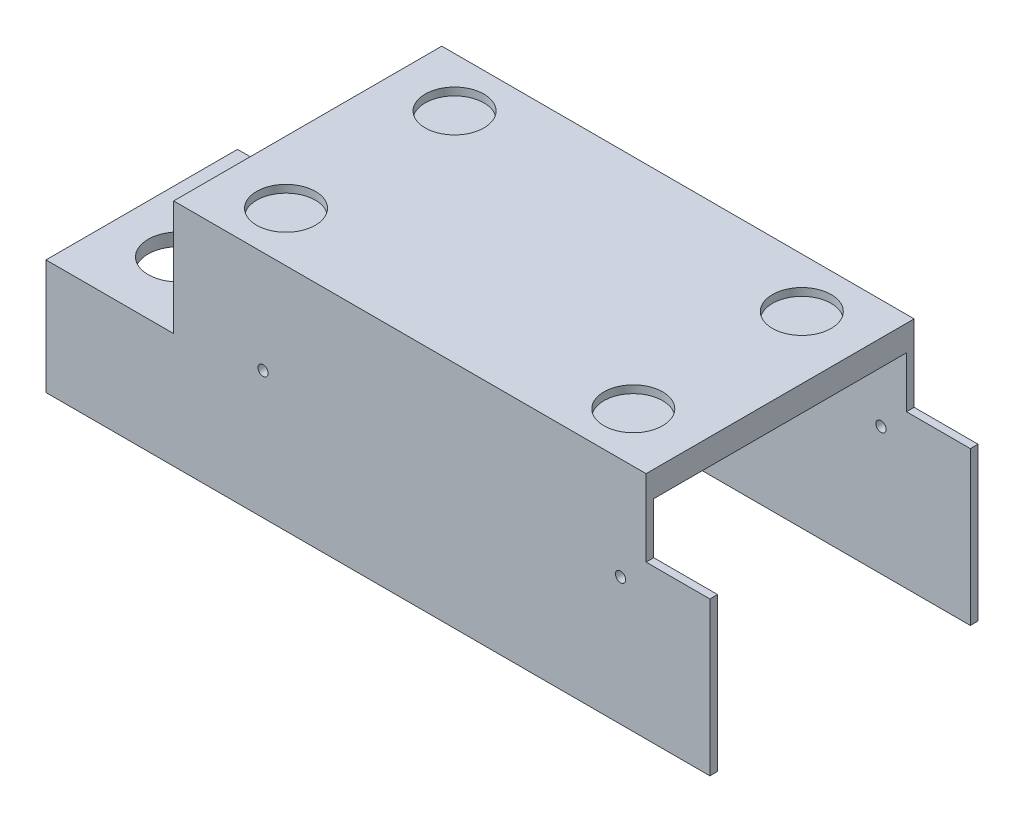
ISO-10303-21;
HEADER;
FILE_DESCRIPTION(('STEP AP214'),'2;1');
FILE_NAME('part.step','',(''),(''),'','','');
FILE_SCHEMA(('AUTOMOTIVE_DESIGN { 1 0 10303 214 1 1 1 1 }'));
ENDSEC;
DATA;
#1=APPLICATION_CONTEXT('core data for automotive mechanical design processes');
#2=APPLICATION_PROTOCOL_DEFINITION('international standard','automotive_design',2000,#1);
#3=PRODUCT_CONTEXT('',#1,'mechanical');
#4=PRODUCT('Part','Part','',(#3));
#5=PRODUCT_RELATED_PRODUCT_CATEGORY('part','',(#4));
#6=PRODUCT_DEFINITION_FORMATION('','',#4);
#7=PRODUCT_DEFINITION_CONTEXT('part definition',#1,'design');
#8=PRODUCT_DEFINITION('design','',#6,#7);
#9=PRODUCT_DEFINITION_SHAPE('','',#8);
#10=(LENGTH_UNIT() NAMED_UNIT(*) SI_UNIT(.MILLI.,.METRE.));
#11=(NAMED_UNIT(*) PLANE_ANGLE_UNIT() SI_UNIT($,.RADIAN.));
#12=(NAMED_UNIT(*) SI_UNIT($,.STERADIAN.) SOLID_ANGLE_UNIT());
#13=UNCERTAINTY_MEASURE_WITH_UNIT(LENGTH_MEASURE(1.E-05),#10,'distance_accuracy_value','');
#14=(GEOMETRIC_REPRESENTATION_CONTEXT(3) GLOBAL_UNCERTAINTY_ASSIGNED_CONTEXT((#13)) GLOBAL_UNIT_ASSIGNED_CONTEXT((#10,
#11,#12)) REPRESENTATION_CONTEXT('',''));
#15=CARTESIAN_POINT('',(0.,0.,0.));
#16=DIRECTION('',(0.,0.,1.));
#17=DIRECTION('',(1.,0.,0.));
#18=AXIS2_PLACEMENT_3D('',#15,#16,#17);
#19=CARTESIAN_POINT('',(105.,90.,-52.5));
#20=DIRECTION('',(-1.,0.,0.));
#21=DIRECTION('',(0.,0.,1.));
#22=AXIS2_PLACEMENT_3D('',#19,#20,#21);
#23=PLANE('',#22);
#24=DIRECTION('',(0.,-1.,0.));
#25=VECTOR('',#24,1.);
#26=CARTESIAN_POINT('',(105.,90.,-52.5));
#27=LINE('',#26,#25);
#28=CARTESIAN_POINT('',(105.,60.,-52.5));
#29=VERTEX_POINT('',#28);
#30=CARTESIAN_POINT('',(105.,0.,-52.5));
#31=VERTEX_POINT('',#30);
#32=EDGE_CURVE('E184',#29,#31,#27,.T.);
#33=ORIENTED_EDGE('',*,*,#32,.F.);
#34=DIRECTION('',(0.,0.,-1.));
#35=VECTOR('',#34,1.);
#36=CARTESIAN_POINT('',(105.,60.,-52.5));
#37=LINE('',#36,#35);
#38=CARTESIAN_POINT('',(105.,60.,-49.5));
#39=VERTEX_POINT('',#38);
#40=EDGE_CURVE('E167',#39,#29,#37,.T.);
#41=ORIENTED_EDGE('',*,*,#40,.F.);
#42=DIRECTION('',(0.,1.,0.));
#43=VECTOR('',#42,1.);
#44=CARTESIAN_POINT('',(105.,0.,-49.5));
#45=LINE('',#44,#43);
#46=CARTESIAN_POINT('',(105.,0.,-49.5));
#47=VERTEX_POINT('',#46);
#48=EDGE_CURVE('E307',#47,#39,#45,.T.);
#49=ORIENTED_EDGE('',*,*,#48,.F.);
#50=DIRECTION('',(0.,0.,-1.));
#51=VECTOR('',#50,1.);
#52=CARTESIAN_POINT('',(105.,0.,-52.5));
#53=LINE('',#52,#51);
#54=EDGE_CURVE('E191',#47,#31,#53,.T.);
#55=ORIENTED_EDGE('',*,*,#54,.T.);
#56=EDGE_LOOP('',(#33,#41,#49,#55));
#57=FACE_BOUND('',#56,.T.);
#58=ADVANCED_FACE('F42',(#57),#23,.F.);
#59=CARTESIAN_POINT('',(0.,0.,0.));
#60=DIRECTION('',(0.,1.,0.));
#61=DIRECTION('',(0.,0.,1.));
#62=AXIS2_PLACEMENT_3D('',#59,#60,#61);
#63=PLANE('',#62);
#64=DIRECTION('',(0.,0.,-1.));
#65=VECTOR('',#64,1.);
#66=CARTESIAN_POINT('',(-95.,0.,49.5));
#67=LINE('',#66,#65);
#68=CARTESIAN_POINT('',(-95.,0.,-19.5));
#69=VERTEX_POINT('',#68);
#70=CARTESIAN_POINT('',(-95.,0.,-49.5));
#71=VERTEX_POINT('',#70);
#72=EDGE_CURVE('E306',#69,#71,#67,.T.);
#73=ORIENTED_EDGE('',*,*,#72,.F.);
#74=DIRECTION('',(-1.,0.,0.));
#75=VECTOR('',#74,1.);
#76=CARTESIAN_POINT('',(105.,0.,-19.5));
#77=LINE('',#76,#75);
#78=CARTESIAN_POINT('',(-155.,0.,-19.5));
#79=VERTEX_POINT('',#78);
#80=EDGE_CURVE('E248',#69,#79,#77,.T.);
#81=ORIENTED_EDGE('',*,*,#80,.T.);
#82=DIRECTION('',(0.,0.,1.));
#83=VECTOR('',#82,1.);
#84=CARTESIAN_POINT('',(-155.,0.,52.5));
#85=LINE('',#84,#83);
#86=CARTESIAN_POINT('',(-155.,0.,-22.5));
#87=VERTEX_POINT('',#86);
#88=EDGE_CURVE('E279',#87,#79,#85,.T.);
#89=ORIENTED_EDGE('',*,*,#88,.F.);
#90=DIRECTION('',(1.,0.,0.));
#91=VECTOR('',#90,1.);
#92=CARTESIAN_POINT('',(-155.,0.,-22.5));
#93=LINE('',#92,#91);
#94=CARTESIAN_POINT('',(-105.,0.,-22.5));
#95=VERTEX_POINT('',#94);
#96=EDGE_CURVE('E283',#87,#95,#93,.T.);
#97=ORIENTED_EDGE('',*,*,#96,.T.);
#98=DIRECTION('',(0.,0.,1.));
#99=VECTOR('',#98,1.);
#100=CARTESIAN_POINT('',(-105.,0.,-52.5));
#101=LINE('',#100,#99);
#102=CARTESIAN_POINT('',(-105.,0.,-52.5));
#103=VERTEX_POINT('',#102);
#104=EDGE_CURVE('E354',#103,#95,#101,.T.);
#105=ORIENTED_EDGE('',*,*,#104,.F.);
#106=DIRECTION('',(-1.,0.,0.));
#107=VECTOR('',#106,1.);
#108=CARTESIAN_POINT('',(-105.,0.,-52.5));
#109=LINE('',#108,#107);
#110=EDGE_CURVE('E351',#31,#103,#109,.T.);
#111=ORIENTED_EDGE('',*,*,#110,.F.);
#112=ORIENTED_EDGE('',*,*,#54,.F.);
#113=DIRECTION('',(1.,0.,0.));
#114=VECTOR('',#113,1.);
#115=CARTESIAN_POINT('',(-95.,0.,-49.5));
#116=LINE('',#115,#114);
#117=EDGE_CURVE('E330',#71,#47,#116,.T.);
#118=ORIENTED_EDGE('',*,*,#117,.F.);
#119=EDGE_LOOP('',(#73,#81,#89,#97,#105,#111,#112,#118));
#120=FACE_BOUND('',#119,.T.);
#121=ADVANCED_FACE('F457',(#120),#63,.F.);
#122=CARTESIAN_POINT('',(-105.,90.,-52.5));
#123=DIRECTION('',(1.,0.,0.));
#124=DIRECTION('',(0.,0.,-1.));
#125=AXIS2_PLACEMENT_3D('',#122,#123,#124);
#126=PLANE('',#125);
#127=DIRECTION('',(0.,-1.,0.));
#128=VECTOR('',#127,1.);
#129=CARTESIAN_POINT('',(-105.,0.,-22.5));
#130=LINE('',#129,#128);
#131=CARTESIAN_POINT('',(-105.,45.,-22.5));
#132=VERTEX_POINT('',#131);
#133=EDGE_CURVE('E272',#132,#95,#130,.T.);
#134=ORIENTED_EDGE('',*,*,#133,.F.);
#135=DIRECTION('',(0.,0.,-1.));
#136=VECTOR('',#135,1.);
#137=CARTESIAN_POINT('',(-105.,45.,52.5));
#138=LINE('',#137,#136);
#139=CARTESIAN_POINT('',(-105.,45.,52.5));
#140=VERTEX_POINT('',#139);
#141=EDGE_CURVE('E266',#140,#132,#138,.T.);
#142=ORIENTED_EDGE('',*,*,#141,.F.);
#143=DIRECTION('',(0.,-1.,0.));
#144=VECTOR('',#143,1.);
#145=CARTESIAN_POINT('',(-105.,90.,52.5));
#146=LINE('',#145,#144);
#147=CARTESIAN_POINT('',(-105.,90.,52.5));
#148=VERTEX_POINT('',#147);
#149=EDGE_CURVE('E200',#148,#140,#146,.T.);
#150=ORIENTED_EDGE('',*,*,#149,.F.);
#151=DIRECTION('',(0.,0.,1.));
#152=VECTOR('',#151,1.);
#153=CARTESIAN_POINT('',(-105.,90.,-52.5));
#154=LINE('',#153,#152);
#155=CARTESIAN_POINT('',(-105.,90.,-52.5));
#156=VERTEX_POINT('',#155);
#157=EDGE_CURVE('E338',#156,#148,#154,.T.);
#158=ORIENTED_EDGE('',*,*,#157,.F.);
#159=DIRECTION('',(0.,-1.,0.));
#160=VECTOR('',#159,1.);
#161=CARTESIAN_POINT('',(-105.,90.,-52.5));
#162=LINE('',#161,#160);
#163=EDGE_CURVE('E194',#156,#103,#162,.T.);
#164=ORIENTED_EDGE('',*,*,#163,.T.);
#165=ORIENTED_EDGE('',*,*,#104,.T.);
#166=EDGE_LOOP('',(#134,#142,#150,#158,#164,#165));
#167=FACE_BOUND('',#166,.T.);
#168=ADVANCED_FACE('F461',(#167),#126,.F.);
#169=DIRECTION('',(0.,-1.,0.));
#170=VECTOR('',#169,1.);
#171=CARTESIAN_POINT('',(105.,0.,49.5));
#172=LINE('',#171,#170);
#173=CARTESIAN_POINT('',(105.,60.,49.5));
#174=VERTEX_POINT('',#173);
#175=CARTESIAN_POINT('',(105.,0.,49.5));
#176=VERTEX_POINT('',#175);
#177=EDGE_CURVE('E301',#174,#176,#172,.T.);
#178=ORIENTED_EDGE('',*,*,#177,.F.);
#179=CARTESIAN_POINT('',(105.,60.,52.5));
#180=VERTEX_POINT('',#179);
#181=EDGE_CURVE('E178',#180,#174,#37,.T.);
#182=ORIENTED_EDGE('',*,*,#181,.F.);
#183=DIRECTION('',(0.,-1.,0.));
#184=VECTOR('',#183,1.);
#185=CARTESIAN_POINT('',(105.,90.,52.5));
#186=LINE('',#185,#184);
#187=CARTESIAN_POINT('',(105.,0.,52.5));
#188=VERTEX_POINT('',#187);
#189=EDGE_CURVE('E346',#180,#188,#186,.T.);
#190=ORIENTED_EDGE('',*,*,#189,.T.);
#191=EDGE_CURVE('E347',#188,#176,#53,.T.);
#192=ORIENTED_EDGE('',*,*,#191,.T.);
#193=EDGE_LOOP('',(#178,#182,#190,#192));
#194=FACE_BOUND('',#193,.T.);
#195=ADVANCED_FACE('F44',(#194),#23,.F.);
#196=CARTESIAN_POINT('',(-105.,90.,-52.5));
#197=DIRECTION('',(0.,0.,1.));
#198=DIRECTION('',(1.,0.,0.));
#199=AXIS2_PLACEMENT_3D('',#196,#197,#198);
#200=PLANE('',#199);
#201=CARTESIAN_POINT('',(-70.,50.,-52.5));
#202=DIRECTION('',(0.,0.,1.));
#203=DIRECTION('',(1.,0.,0.));
#204=AXIS2_PLACEMENT_3D('',#201,#202,#203);
#205=CIRCLE('',#204,2.);
#206=CARTESIAN_POINT('',(-68.,50.,-52.5));
#207=VERTEX_POINT('',#206);
#208=EDGE_CURVE('E215',#207,#207,#205,.T.);
#209=ORIENTED_EDGE('',*,*,#208,.T.);
#210=EDGE_LOOP('',(#209));
#211=FACE_BOUND('',#210,.T.);
#212=CARTESIAN_POINT('',(70.,50.,-52.5));
#213=DIRECTION('',(0.,0.,1.));
#214=DIRECTION('',(1.,0.,0.));
#215=AXIS2_PLACEMENT_3D('',#212,#213,#214);
#216=CIRCLE('',#215,2.);
#217=CARTESIAN_POINT('',(72.,50.,-52.5));
#218=VERTEX_POINT('',#217);
#219=EDGE_CURVE('E428',#218,#218,#216,.T.);
#220=ORIENTED_EDGE('',*,*,#219,.T.);
#221=EDGE_LOOP('',(#220));
#222=FACE_BOUND('',#221,.T.);
#223=DIRECTION('',(-1.,0.,0.));
#224=VECTOR('',#223,1.);
#225=CARTESIAN_POINT('',(-105.,90.,-52.5));
#226=LINE('',#225,#224);
#227=CARTESIAN_POINT('',(80.,90.,-52.5));
#228=VERTEX_POINT('',#227);
#229=EDGE_CURVE('E335',#228,#156,#226,.T.);
#230=ORIENTED_EDGE('',*,*,#229,.F.);
#231=DIRECTION('',(0.,1.,0.));
#232=VECTOR('',#231,1.);
#233=CARTESIAN_POINT('',(80.,60.,-52.5));
#234=LINE('',#233,#232);
#235=CARTESIAN_POINT('',(80.,60.,-52.5));
#236=VERTEX_POINT('',#235);
#237=EDGE_CURVE('E186',#236,#228,#234,.T.);
#238=ORIENTED_EDGE('',*,*,#237,.F.);
#239=DIRECTION('',(-1.,0.,0.));
#240=VECTOR('',#239,1.);
#241=CARTESIAN_POINT('',(105.,60.,-52.5));
#242=LINE('',#241,#240);
#243=EDGE_CURVE('E170',#29,#236,#242,.T.);
#244=ORIENTED_EDGE('',*,*,#243,.F.);
#245=ORIENTED_EDGE('',*,*,#32,.T.);
#246=ORIENTED_EDGE('',*,*,#110,.T.);
#247=ORIENTED_EDGE('',*,*,#163,.F.);
#248=EDGE_LOOP('',(#230,#238,#244,#245,#246,#247));
#249=FACE_BOUND('',#248,.T.);
#250=ADVANCED_FACE('F183',(#211,#222,#249),#200,.F.);
#251=CARTESIAN_POINT('',(-105.,90.,52.5));
#252=DIRECTION('',(0.,0.,-1.));
#253=DIRECTION('',(-1.,0.,0.));
#254=AXIS2_PLACEMENT_3D('',#251,#252,#253);
#255=PLANE('',#254);
#256=CARTESIAN_POINT('',(-70.,50.,52.5));
#257=DIRECTION('',(0.,0.,1.));
#258=DIRECTION('',(1.,0.,0.));
#259=AXIS2_PLACEMENT_3D('',#256,#257,#258);
#260=CIRCLE('',#259,2.);
#261=CARTESIAN_POINT('',(-68.,50.,52.5));
#262=VERTEX_POINT('',#261);
#263=EDGE_CURVE('E425',#262,#262,#260,.T.);
#264=ORIENTED_EDGE('',*,*,#263,.F.);
#265=EDGE_LOOP('',(#264));
#266=FACE_BOUND('',#265,.T.);
#267=CARTESIAN_POINT('',(70.,50.,52.5));
#268=DIRECTION('',(0.,0.,1.));
#269=DIRECTION('',(1.,0.,0.));
#270=AXIS2_PLACEMENT_3D('',#267,#268,#269);
#271=CIRCLE('',#270,2.);
#272=CARTESIAN_POINT('',(72.,50.,52.5));
#273=VERTEX_POINT('',#272);
#274=EDGE_CURVE('E233',#273,#273,#271,.T.);
#275=ORIENTED_EDGE('',*,*,#274,.F.);
#276=EDGE_LOOP('',(#275));
#277=FACE_BOUND('',#276,.T.);
#278=DIRECTION('',(1.,0.,0.));
#279=VECTOR('',#278,1.);
#280=CARTESIAN_POINT('',(105.,60.,52.5));
#281=LINE('',#280,#279);
#282=CARTESIAN_POINT('',(80.,60.,52.5));
#283=VERTEX_POINT('',#282);
#284=EDGE_CURVE('E400',#283,#180,#281,.T.);
#285=ORIENTED_EDGE('',*,*,#284,.F.);
#286=DIRECTION('',(0.,1.,0.));
#287=VECTOR('',#286,1.);
#288=CARTESIAN_POINT('',(80.,60.,52.5));
#289=LINE('',#288,#287);
#290=CARTESIAN_POINT('',(80.,90.,52.5));
#291=VERTEX_POINT('',#290);
#292=EDGE_CURVE('E406',#283,#291,#289,.T.);
#293=ORIENTED_EDGE('',*,*,#292,.T.);
#294=DIRECTION('',(1.,0.,0.));
#295=VECTOR('',#294,1.);
#296=CARTESIAN_POINT('',(-105.,90.,52.5));
#297=LINE('',#296,#295);
#298=EDGE_CURVE('E342',#148,#291,#297,.T.);
#299=ORIENTED_EDGE('',*,*,#298,.F.);
#300=ORIENTED_EDGE('',*,*,#149,.T.);
#301=DIRECTION('',(1.,0.,0.));
#302=VECTOR('',#301,1.);
#303=CARTESIAN_POINT('',(-155.,45.,52.5));
#304=LINE('',#303,#302);
#305=CARTESIAN_POINT('',(-155.,45.,52.5));
#306=VERTEX_POINT('',#305);
#307=EDGE_CURVE('E297',#306,#140,#304,.T.);
#308=ORIENTED_EDGE('',*,*,#307,.F.);
#309=DIRECTION('',(0.,1.,0.));
#310=VECTOR('',#309,1.);
#311=CARTESIAN_POINT('',(-155.,0.,52.5));
#312=LINE('',#311,#310);
#313=CARTESIAN_POINT('',(-155.,0.,52.5));
#314=VERTEX_POINT('',#313);
#315=EDGE_CURVE('E267',#314,#306,#312,.T.);
#316=ORIENTED_EDGE('',*,*,#315,.F.);
#317=DIRECTION('',(1.,0.,0.));
#318=VECTOR('',#317,1.);
#319=CARTESIAN_POINT('',(-105.,0.,52.5));
#320=LINE('',#319,#318);
#321=EDGE_CURVE('E339',#314,#188,#320,.T.);
#322=ORIENTED_EDGE('',*,*,#321,.T.);
#323=ORIENTED_EDGE('',*,*,#189,.F.);
#324=EDGE_LOOP('',(#285,#293,#299,#300,#308,#316,#322,#323));
#325=FACE_BOUND('',#324,.T.);
#326=ADVANCED_FACE('F369',(#266,#277,#325),#255,.F.);
#327=CARTESIAN_POINT('',(0.,90.,0.));
#328=DIRECTION('',(0.,1.,0.));
#329=DIRECTION('',(0.,0.,1.));
#330=AXIS2_PLACEMENT_3D('',#327,#328,#329);
#331=PLANE('',#330);
#332=CARTESIAN_POINT('',(55.5,90.,-33.));
#333=DIRECTION('',(0.,1.,0.));
#334=DIRECTION('',(0.,0.,1.));
#335=AXIS2_PLACEMENT_3D('',#332,#333,#334);
#336=CIRCLE('',#335,11.5);
#337=CARTESIAN_POINT('',(55.5,90.,-21.5));
#338=VERTEX_POINT('',#337);
#339=EDGE_CURVE('E628',#338,#338,#336,.T.);
#340=ORIENTED_EDGE('',*,*,#339,.F.);
#341=EDGE_LOOP('',(#340));
#342=FACE_BOUND('',#341,.T.);
#343=CARTESIAN_POINT('',(-80.5,90.,33.));
#344=DIRECTION('',(0.,1.,0.));
#345=DIRECTION('',(0.,0.,1.));
#346=AXIS2_PLACEMENT_3D('',#343,#344,#345);
#347=CIRCLE('',#346,11.5);
#348=CARTESIAN_POINT('',(-80.5,90.,44.5));
#349=VERTEX_POINT('',#348);
#350=EDGE_CURVE('E612',#349,#349,#347,.T.);
#351=ORIENTED_EDGE('',*,*,#350,.F.);
#352=EDGE_LOOP('',(#351));
#353=FACE_BOUND('',#352,.T.);
#354=CARTESIAN_POINT('',(55.5,90.,33.));
#355=DIRECTION('',(0.,1.,0.));
#356=DIRECTION('',(0.,0.,1.));
#357=AXIS2_PLACEMENT_3D('',#354,#355,#356);
#358=CIRCLE('',#357,11.5);
#359=CARTESIAN_POINT('',(55.5,90.,44.5));
#360=VERTEX_POINT('',#359);
#361=EDGE_CURVE('E613',#360,#360,#358,.T.);
#362=ORIENTED_EDGE('',*,*,#361,.F.);
#363=EDGE_LOOP('',(#362));
#364=FACE_BOUND('',#363,.T.);
#365=CARTESIAN_POINT('',(-80.5,90.,-33.));
#366=DIRECTION('',(0.,1.,0.));
#367=DIRECTION('',(0.,0.,1.));
#368=AXIS2_PLACEMENT_3D('',#365,#366,#367);
#369=CIRCLE('',#368,11.5);
#370=CARTESIAN_POINT('',(-80.5,90.,-21.5));
#371=VERTEX_POINT('',#370);
#372=EDGE_CURVE('E395',#371,#371,#369,.T.);
#373=ORIENTED_EDGE('',*,*,#372,.F.);
#374=EDGE_LOOP('',(#373));
#375=FACE_BOUND('',#374,.T.);
#376=DIRECTION('',(0.,0.,1.));
#377=VECTOR('',#376,1.);
#378=CARTESIAN_POINT('',(80.,90.,-52.5));
#379=LINE('',#378,#377);
#380=EDGE_CURVE('E179',#228,#291,#379,.T.);
#381=ORIENTED_EDGE('',*,*,#380,.F.);
#382=ORIENTED_EDGE('',*,*,#229,.T.);
#383=ORIENTED_EDGE('',*,*,#157,.T.);
#384=ORIENTED_EDGE('',*,*,#298,.T.);
#385=EDGE_LOOP('',(#381,#382,#383,#384));
#386=FACE_BOUND('',#385,.T.);
#387=ADVANCED_FACE('F443',(#342,#353,#364,#375,#386),#331,.T.);
#388=CARTESIAN_POINT('',(-155.,0.,49.5));
#389=VERTEX_POINT('',#388);
#390=EDGE_CURVE('E278',#389,#314,#85,.T.);
#391=ORIENTED_EDGE('',*,*,#390,.F.);
#392=DIRECTION('',(1.,0.,0.));
#393=VECTOR('',#392,1.);
#394=CARTESIAN_POINT('',(-95.,0.,49.5));
#395=LINE('',#394,#393);
#396=EDGE_CURVE('E66',#389,#176,#395,.T.);
#397=ORIENTED_EDGE('',*,*,#396,.T.);
#398=ORIENTED_EDGE('',*,*,#191,.F.);
#399=ORIENTED_EDGE('',*,*,#321,.F.);
#400=EDGE_LOOP('',(#391,#397,#398,#399));
#401=FACE_BOUND('',#400,.T.);
#402=ADVANCED_FACE('F386',(#401),#63,.F.);
#403=CARTESIAN_POINT('',(-95.,0.,49.5));
#404=DIRECTION('',(0.,0.,1.));
#405=DIRECTION('',(1.,0.,0.));
#406=AXIS2_PLACEMENT_3D('',#403,#404,#405);
#407=PLANE('',#406);
#408=CARTESIAN_POINT('',(-70.,50.,49.5));
#409=DIRECTION('',(0.,0.,1.));
#410=DIRECTION('',(1.,0.,0.));
#411=AXIS2_PLACEMENT_3D('',#408,#409,#410);
#412=CIRCLE('',#411,2.);
#413=CARTESIAN_POINT('',(-68.,50.,49.5));
#414=VERTEX_POINT('',#413);
#415=EDGE_CURVE('E219',#414,#414,#412,.T.);
#416=ORIENTED_EDGE('',*,*,#415,.T.);
#417=EDGE_LOOP('',(#416));
#418=FACE_BOUND('',#417,.T.);
#419=CARTESIAN_POINT('',(70.,50.,49.5));
#420=DIRECTION('',(0.,0.,1.));
#421=DIRECTION('',(1.,0.,0.));
#422=AXIS2_PLACEMENT_3D('',#419,#420,#421);
#423=CIRCLE('',#422,2.);
#424=CARTESIAN_POINT('',(72.,50.,49.5));
#425=VERTEX_POINT('',#424);
#426=EDGE_CURVE('E214',#425,#425,#423,.T.);
#427=ORIENTED_EDGE('',*,*,#426,.T.);
#428=EDGE_LOOP('',(#427));
#429=FACE_BOUND('',#428,.T.);
#430=DIRECTION('',(1.,0.,0.));
#431=VECTOR('',#430,1.);
#432=CARTESIAN_POINT('',(-95.,80.,49.5));
#433=LINE('',#432,#431);
#434=CARTESIAN_POINT('',(-95.,80.,49.5));
#435=VERTEX_POINT('',#434);
#436=CARTESIAN_POINT('',(80.,80.,49.5));
#437=VERTEX_POINT('',#436);
#438=EDGE_CURVE('E322',#435,#437,#433,.T.);
#439=ORIENTED_EDGE('',*,*,#438,.T.);
#440=DIRECTION('',(0.,-1.,0.));
#441=VECTOR('',#440,1.);
#442=CARTESIAN_POINT('',(80.,0.,49.5));
#443=LINE('',#442,#441);
#444=CARTESIAN_POINT('',(80.,60.,49.5));
#445=VERTEX_POINT('',#444);
#446=EDGE_CURVE('E418',#437,#445,#443,.T.);
#447=ORIENTED_EDGE('',*,*,#446,.T.);
#448=DIRECTION('',(1.,0.,0.));
#449=VECTOR('',#448,1.);
#450=CARTESIAN_POINT('',(-95.,60.,49.5));
#451=LINE('',#450,#449);
#452=EDGE_CURVE('E409',#445,#174,#451,.T.);
#453=ORIENTED_EDGE('',*,*,#452,.T.);
#454=ORIENTED_EDGE('',*,*,#177,.T.);
#455=ORIENTED_EDGE('',*,*,#396,.F.);
#456=DIRECTION('',(0.,1.,0.));
#457=VECTOR('',#456,1.);
#458=CARTESIAN_POINT('',(-155.,40.,49.5));
#459=LINE('',#458,#457);
#460=CARTESIAN_POINT('',(-155.,40.,49.5));
#461=VERTEX_POINT('',#460);
#462=EDGE_CURVE('E241',#389,#461,#459,.T.);
#463=ORIENTED_EDGE('',*,*,#462,.T.);
#464=DIRECTION('',(-1.,0.,0.));
#465=VECTOR('',#464,1.);
#466=CARTESIAN_POINT('',(105.,40.,49.5));
#467=LINE('',#466,#465);
#468=CARTESIAN_POINT('',(-95.,40.,49.5));
#469=VERTEX_POINT('',#468);
#470=EDGE_CURVE('E253',#469,#461,#467,.T.);
#471=ORIENTED_EDGE('',*,*,#470,.F.);
#472=DIRECTION('',(0.,-1.,0.));
#473=VECTOR('',#472,1.);
#474=CARTESIAN_POINT('',(-95.,0.,49.5));
#475=LINE('',#474,#473);
#476=EDGE_CURVE('E302',#435,#469,#475,.T.);
#477=ORIENTED_EDGE('',*,*,#476,.F.);
#478=EDGE_LOOP('',(#439,#447,#453,#454,#455,#463,#471,#477));
#479=FACE_BOUND('',#478,.T.);
#480=ADVANCED_FACE('F483',(#418,#429,#479),#407,.F.);
#481=CARTESIAN_POINT('',(-95.,80.,49.5));
#482=DIRECTION('',(0.,1.,0.));
#483=DIRECTION('',(0.,0.,1.));
#484=AXIS2_PLACEMENT_3D('',#481,#482,#483);
#485=PLANE('',#484);
#486=DIRECTION('',(1.,0.,0.));
#487=VECTOR('',#486,1.);
#488=CARTESIAN_POINT('',(-95.,80.,-49.5));
#489=LINE('',#488,#487);
#490=CARTESIAN_POINT('',(-95.,80.,-49.5));
#491=VERTEX_POINT('',#490);
#492=CARTESIAN_POINT('',(80.,80.,-49.5));
#493=VERTEX_POINT('',#492);
#494=EDGE_CURVE('E326',#491,#493,#489,.T.);
#495=ORIENTED_EDGE('',*,*,#494,.T.);
#496=DIRECTION('',(0.,0.,1.));
#497=VECTOR('',#496,1.);
#498=CARTESIAN_POINT('',(80.,80.,49.5));
#499=LINE('',#498,#497);
#500=EDGE_CURVE('E414',#493,#437,#499,.T.);
#501=ORIENTED_EDGE('',*,*,#500,.T.);
#502=ORIENTED_EDGE('',*,*,#438,.F.);
#503=DIRECTION('',(0.,0.,1.));
#504=VECTOR('',#503,1.);
#505=CARTESIAN_POINT('',(-95.,80.,49.5));
#506=LINE('',#505,#504);
#507=EDGE_CURVE('E314',#491,#435,#506,.T.);
#508=ORIENTED_EDGE('',*,*,#507,.F.);
#509=EDGE_LOOP('',(#495,#501,#502,#508));
#510=FACE_BOUND('',#509,.T.);
#511=ADVANCED_FACE('F527',(#510),#485,.F.);
#512=CARTESIAN_POINT('',(-95.,0.,-49.5));
#513=DIRECTION('',(0.,0.,-1.));
#514=DIRECTION('',(-1.,0.,0.));
#515=AXIS2_PLACEMENT_3D('',#512,#513,#514);
#516=PLANE('',#515);
#517=CARTESIAN_POINT('',(-70.,50.,-49.5));
#518=DIRECTION('',(0.,0.,-1.));
#519=DIRECTION('',(-1.,0.,0.));
#520=AXIS2_PLACEMENT_3D('',#517,#518,#519);
#521=CIRCLE('',#520,2.);
#522=CARTESIAN_POINT('',(-72.,50.,-49.5));
#523=VERTEX_POINT('',#522);
#524=EDGE_CURVE('E216',#523,#523,#521,.T.);
#525=ORIENTED_EDGE('',*,*,#524,.T.);
#526=EDGE_LOOP('',(#525));
#527=FACE_BOUND('',#526,.T.);
#528=CARTESIAN_POINT('',(70.,50.,-49.5));
#529=DIRECTION('',(0.,0.,-1.));
#530=DIRECTION('',(-1.,0.,0.));
#531=AXIS2_PLACEMENT_3D('',#528,#529,#530);
#532=CIRCLE('',#531,2.);
#533=CARTESIAN_POINT('',(68.,50.,-49.5));
#534=VERTEX_POINT('',#533);
#535=EDGE_CURVE('E210',#534,#534,#532,.T.);
#536=ORIENTED_EDGE('',*,*,#535,.T.);
#537=EDGE_LOOP('',(#536));
#538=FACE_BOUND('',#537,.T.);
#539=DIRECTION('',(-1.,0.,0.));
#540=VECTOR('',#539,1.);
#541=CARTESIAN_POINT('',(-95.,60.,-49.5));
#542=LINE('',#541,#540);
#543=CARTESIAN_POINT('',(80.,60.,-49.5));
#544=VERTEX_POINT('',#543);
#545=EDGE_CURVE('E51',#39,#544,#542,.T.);
#546=ORIENTED_EDGE('',*,*,#545,.T.);
#547=DIRECTION('',(0.,1.,0.));
#548=VECTOR('',#547,1.);
#549=CARTESIAN_POINT('',(80.,0.,-49.5));
#550=LINE('',#549,#548);
#551=EDGE_CURVE('E11',#544,#493,#550,.T.);
#552=ORIENTED_EDGE('',*,*,#551,.T.);
#553=ORIENTED_EDGE('',*,*,#494,.F.);
#554=DIRECTION('',(0.,1.,0.));
#555=VECTOR('',#554,1.);
#556=CARTESIAN_POINT('',(-95.,0.,-49.5));
#557=LINE('',#556,#555);
#558=EDGE_CURVE('E310',#71,#491,#557,.T.);
#559=ORIENTED_EDGE('',*,*,#558,.F.);
#560=ORIENTED_EDGE('',*,*,#117,.T.);
#561=ORIENTED_EDGE('',*,*,#48,.T.);
#562=EDGE_LOOP('',(#546,#552,#553,#559,#560,#561));
#563=FACE_BOUND('',#562,.T.);
#564=ADVANCED_FACE('F534',(#527,#538,#563),#516,.F.);
#565=CARTESIAN_POINT('',(-95.,0.,0.));
#566=DIRECTION('',(-1.,0.,0.));
#567=DIRECTION('',(0.,0.,1.));
#568=AXIS2_PLACEMENT_3D('',#565,#566,#567);
#569=PLANE('',#568);
#570=DIRECTION('',(0.,0.,-1.));
#571=VECTOR('',#570,1.);
#572=CARTESIAN_POINT('',(-95.,40.,0.));
#573=LINE('',#572,#571);
#574=CARTESIAN_POINT('',(-95.,40.,-19.5));
#575=VERTEX_POINT('',#574);
#576=EDGE_CURVE('E252',#469,#575,#573,.T.);
#577=ORIENTED_EDGE('',*,*,#576,.T.);
#578=DIRECTION('',(0.,-1.,0.));
#579=VECTOR('',#578,1.);
#580=CARTESIAN_POINT('',(-95.,0.,-19.5));
#581=LINE('',#580,#579);
#582=EDGE_CURVE('E262',#575,#69,#581,.T.);
#583=ORIENTED_EDGE('',*,*,#582,.T.);
#584=ORIENTED_EDGE('',*,*,#72,.T.);
#585=ORIENTED_EDGE('',*,*,#558,.T.);
#586=ORIENTED_EDGE('',*,*,#507,.T.);
#587=ORIENTED_EDGE('',*,*,#476,.T.);
#588=EDGE_LOOP('',(#577,#583,#584,#585,#586,#587));
#589=FACE_BOUND('',#588,.T.);
#590=ADVANCED_FACE('F539',(#589),#569,.F.);
#591=CARTESIAN_POINT('',(-155.,45.,52.5));
#592=DIRECTION('',(0.,-1.,0.));
#593=DIRECTION('',(0.,0.,-1.));
#594=AXIS2_PLACEMENT_3D('',#591,#592,#593);
#595=PLANE('',#594);
#596=CARTESIAN_POINT('',(-130.,45.,25.5));
#597=DIRECTION('',(0.,1.,0.));
#598=DIRECTION('',(0.,0.,1.));
#599=AXIS2_PLACEMENT_3D('',#596,#597,#598);
#600=CIRCLE('',#599,12.);
#601=CARTESIAN_POINT('',(-130.,45.,37.5));
#602=VERTEX_POINT('',#601);
#603=EDGE_CURVE('E209',#602,#602,#600,.T.);
#604=ORIENTED_EDGE('',*,*,#603,.F.);
#605=EDGE_LOOP('',(#604));
#606=FACE_BOUND('',#605,.T.);
#607=ORIENTED_EDGE('',*,*,#141,.T.);
#608=DIRECTION('',(1.,0.,0.));
#609=VECTOR('',#608,1.);
#610=CARTESIAN_POINT('',(-155.,45.,-22.5));
#611=LINE('',#610,#609);
#612=CARTESIAN_POINT('',(-155.,45.,-22.5));
#613=VERTEX_POINT('',#612);
#614=EDGE_CURVE('E293',#613,#132,#611,.T.);
#615=ORIENTED_EDGE('',*,*,#614,.F.);
#616=DIRECTION('',(0.,0.,-1.));
#617=VECTOR('',#616,1.);
#618=CARTESIAN_POINT('',(-155.,45.,52.5));
#619=LINE('',#618,#617);
#620=EDGE_CURVE('E271',#306,#613,#619,.T.);
#621=ORIENTED_EDGE('',*,*,#620,.F.);
#622=ORIENTED_EDGE('',*,*,#307,.T.);
#623=EDGE_LOOP('',(#607,#615,#621,#622));
#624=FACE_BOUND('',#623,.T.);
#625=ADVANCED_FACE('F375',(#606,#624),#595,.F.);
#626=CARTESIAN_POINT('',(-155.,0.,-22.5));
#627=DIRECTION('',(0.,0.,1.));
#628=DIRECTION('',(1.,0.,0.));
#629=AXIS2_PLACEMENT_3D('',#626,#627,#628);
#630=PLANE('',#629);
#631=ORIENTED_EDGE('',*,*,#133,.T.);
#632=ORIENTED_EDGE('',*,*,#96,.F.);
#633=DIRECTION('',(0.,-1.,0.));
#634=VECTOR('',#633,1.);
#635=CARTESIAN_POINT('',(-155.,0.,-22.5));
#636=LINE('',#635,#634);
#637=EDGE_CURVE('E275',#613,#87,#636,.T.);
#638=ORIENTED_EDGE('',*,*,#637,.F.);
#639=ORIENTED_EDGE('',*,*,#614,.T.);
#640=EDGE_LOOP('',(#631,#632,#638,#639));
#641=FACE_BOUND('',#640,.T.);
#642=ADVANCED_FACE('F472',(#641),#630,.F.);
#643=CARTESIAN_POINT('',(-155.,0.,0.));
#644=DIRECTION('',(-1.,0.,0.));
#645=DIRECTION('',(0.,0.,1.));
#646=AXIS2_PLACEMENT_3D('',#643,#644,#645);
#647=PLANE('',#646);
#648=DIRECTION('',(0.,-1.,0.));
#649=VECTOR('',#648,1.);
#650=CARTESIAN_POINT('',(-155.,40.,-19.5));
#651=LINE('',#650,#649);
#652=CARTESIAN_POINT('',(-155.,40.,-19.5));
#653=VERTEX_POINT('',#652);
#654=EDGE_CURVE('E208',#653,#79,#651,.T.);
#655=ORIENTED_EDGE('',*,*,#654,.F.);
#656=DIRECTION('',(0.,0.,-1.));
#657=VECTOR('',#656,1.);
#658=CARTESIAN_POINT('',(-155.,40.,-19.5));
#659=LINE('',#658,#657);
#660=EDGE_CURVE('E244',#461,#653,#659,.T.);
#661=ORIENTED_EDGE('',*,*,#660,.F.);
#662=ORIENTED_EDGE('',*,*,#462,.F.);
#663=ORIENTED_EDGE('',*,*,#390,.T.);
#664=ORIENTED_EDGE('',*,*,#315,.T.);
#665=ORIENTED_EDGE('',*,*,#620,.T.);
#666=ORIENTED_EDGE('',*,*,#637,.T.);
#667=ORIENTED_EDGE('',*,*,#88,.T.);
#668=EDGE_LOOP('',(#655,#661,#662,#663,#664,#665,#666,#667));
#669=FACE_BOUND('',#668,.T.);
#670=ADVANCED_FACE('F380',(#669),#647,.T.);
#671=CARTESIAN_POINT('',(105.,40.,-19.5));
#672=DIRECTION('',(0.,0.,-1.));
#673=DIRECTION('',(0.,1.,0.));
#674=AXIS2_PLACEMENT_3D('',#671,#672,#673);
#675=PLANE('',#674);
#676=DIRECTION('',(-1.,0.,0.));
#677=VECTOR('',#676,1.);
#678=CARTESIAN_POINT('',(105.,40.,-19.5));
#679=LINE('',#678,#677);
#680=EDGE_CURVE('E249',#575,#653,#679,.T.);
#681=ORIENTED_EDGE('',*,*,#680,.T.);
#682=ORIENTED_EDGE('',*,*,#654,.T.);
#683=ORIENTED_EDGE('',*,*,#80,.F.);
#684=ORIENTED_EDGE('',*,*,#582,.F.);
#685=EDGE_LOOP('',(#681,#682,#683,#684));
#686=FACE_BOUND('',#685,.T.);
#687=ADVANCED_FACE('F477',(#686),#675,.F.);
#688=CARTESIAN_POINT('',(105.,40.,-19.5));
#689=DIRECTION('',(0.,1.,0.));
#690=DIRECTION('',(0.,0.,1.));
#691=AXIS2_PLACEMENT_3D('',#688,#689,#690);
#692=PLANE('',#691);
#693=CARTESIAN_POINT('',(-130.,40.,25.5));
#694=DIRECTION('',(0.,1.,0.));
#695=DIRECTION('',(0.,0.,1.));
#696=AXIS2_PLACEMENT_3D('',#693,#694,#695);
#697=CIRCLE('',#696,12.);
#698=CARTESIAN_POINT('',(-130.,40.,37.5));
#699=VERTEX_POINT('',#698);
#700=EDGE_CURVE('E204',#699,#699,#697,.T.);
#701=ORIENTED_EDGE('',*,*,#700,.T.);
#702=EDGE_LOOP('',(#701));
#703=FACE_BOUND('',#702,.T.);
#704=ORIENTED_EDGE('',*,*,#470,.T.);
#705=ORIENTED_EDGE('',*,*,#660,.T.);
#706=ORIENTED_EDGE('',*,*,#680,.F.);
#707=ORIENTED_EDGE('',*,*,#576,.F.);
#708=EDGE_LOOP('',(#704,#705,#706,#707));
#709=FACE_BOUND('',#708,.T.);
#710=ADVANCED_FACE('F480',(#703,#709),#692,.F.);
#711=CARTESIAN_POINT('',(-130.,0.,25.5));
#712=DIRECTION('',(0.,1.,0.));
#713=DIRECTION('',(0.,0.,1.));
#714=AXIS2_PLACEMENT_3D('',#711,#712,#713);
#715=CYLINDRICAL_SURFACE('',#714,12.);
#716=CARTESIAN_POINT('',(-130.,45.,37.5));
#717=CARTESIAN_POINT('',(-130.,44.9479166666667,37.5));
#718=CARTESIAN_POINT('',(-130.,44.8958333333333,37.5));
#719=CARTESIAN_POINT('',(-130.,44.7916666666667,37.5));
#720=CARTESIAN_POINT('',(-130.,44.7395833333333,37.5));
#721=CARTESIAN_POINT('',(-130.,44.6354166666667,37.5));
#722=CARTESIAN_POINT('',(-130.,44.5833333333333,37.5));
#723=CARTESIAN_POINT('',(-130.,44.4791666666667,37.5));
#724=CARTESIAN_POINT('',(-130.,44.4270833333333,37.5));
#725=CARTESIAN_POINT('',(-130.,44.3229166666667,37.5));
#726=CARTESIAN_POINT('',(-130.,44.2708333333333,37.5));
#727=CARTESIAN_POINT('',(-130.,44.1666666666667,37.5));
#728=CARTESIAN_POINT('',(-130.,44.1145833333333,37.5));
#729=CARTESIAN_POINT('',(-130.,44.0104166666667,37.5));
#730=CARTESIAN_POINT('',(-130.,43.9583333333333,37.5));
#731=CARTESIAN_POINT('',(-130.,43.8541666666667,37.5));
#732=CARTESIAN_POINT('',(-130.,43.8020833333333,37.5));
#733=CARTESIAN_POINT('',(-130.,43.6979166666667,37.5));
#734=CARTESIAN_POINT('',(-130.,43.6458333333333,37.5));
#735=CARTESIAN_POINT('',(-130.,43.5416666666667,37.5));
#736=CARTESIAN_POINT('',(-130.,43.4895833333333,37.5));
#737=CARTESIAN_POINT('',(-130.,43.3854166666667,37.5));
#738=CARTESIAN_POINT('',(-130.,43.3333333333333,37.5));
#739=CARTESIAN_POINT('',(-130.,43.2291666666667,37.5));
#740=CARTESIAN_POINT('',(-130.,43.1770833333333,37.5));
#741=CARTESIAN_POINT('',(-130.,43.0729166666667,37.5));
#742=CARTESIAN_POINT('',(-130.,43.0208333333333,37.5));
#743=CARTESIAN_POINT('',(-130.,42.9166666666667,37.5));
#744=CARTESIAN_POINT('',(-130.,42.8645833333333,37.5));
#745=CARTESIAN_POINT('',(-130.,42.7604166666667,37.5));
#746=CARTESIAN_POINT('',(-130.,42.7083333333333,37.5));
#747=CARTESIAN_POINT('',(-130.,42.6041666666667,37.5));
#748=CARTESIAN_POINT('',(-130.,42.5520833333333,37.5));
#749=CARTESIAN_POINT('',(-130.,42.4479166666667,37.5));
#750=CARTESIAN_POINT('',(-130.,42.3958333333333,37.5));
#751=CARTESIAN_POINT('',(-130.,42.2916666666667,37.5));
#752=CARTESIAN_POINT('',(-130.,42.2395833333333,37.5));
#753=CARTESIAN_POINT('',(-130.,42.1354166666667,37.5));
#754=CARTESIAN_POINT('',(-130.,42.0833333333333,37.5));
#755=CARTESIAN_POINT('',(-130.,41.9791666666667,37.5));
#756=CARTESIAN_POINT('',(-130.,41.9270833333333,37.5));
#757=CARTESIAN_POINT('',(-130.,41.8229166666667,37.5));
#758=CARTESIAN_POINT('',(-130.,41.7708333333333,37.5));
#759=CARTESIAN_POINT('',(-130.,41.6666666666667,37.5));
#760=CARTESIAN_POINT('',(-130.,41.6145833333333,37.5));
#761=CARTESIAN_POINT('',(-130.,41.5104166666667,37.5));
#762=CARTESIAN_POINT('',(-130.,41.4583333333333,37.5));
#763=CARTESIAN_POINT('',(-130.,41.3541666666667,37.5));
#764=CARTESIAN_POINT('',(-130.,41.3020833333333,37.5));
#765=CARTESIAN_POINT('',(-130.,41.1979166666667,37.5));
#766=CARTESIAN_POINT('',(-130.,41.1458333333333,37.5));
#767=CARTESIAN_POINT('',(-130.,41.0416666666667,37.5));
#768=CARTESIAN_POINT('',(-130.,40.9895833333333,37.5));
#769=CARTESIAN_POINT('',(-130.,40.8854166666667,37.5));
#770=CARTESIAN_POINT('',(-130.,40.8333333333333,37.5));
#771=CARTESIAN_POINT('',(-130.,40.7291666666667,37.5));
#772=CARTESIAN_POINT('',(-130.,40.6770833333333,37.5));
#773=CARTESIAN_POINT('',(-130.,40.5729166666667,37.5));
#774=CARTESIAN_POINT('',(-130.,40.5208333333333,37.5));
#775=CARTESIAN_POINT('',(-130.,40.4166666666667,37.5));
#776=CARTESIAN_POINT('',(-130.,40.3645833333333,37.5));
#777=CARTESIAN_POINT('',(-130.,40.2604166666667,37.5));
#778=CARTESIAN_POINT('',(-130.,40.2083333333333,37.5));
#779=CARTESIAN_POINT('',(-130.,40.1041666666667,37.5));
#780=CARTESIAN_POINT('',(-130.,40.0520833333333,37.5));
#781=CARTESIAN_POINT('',(-130.,40.,37.5));
#782=B_SPLINE_CURVE_WITH_KNOTS('',3,(#716,#717,#718,#719,#720,#721,#722,#723,#724,#725,#726,
#727,#728,#729,#730,#731,#732,#733,#734,#735,#736,#737,#738,#739,#740,#741,#742,#743,#744,#745,
#746,#747,#748,#749,#750,#751,#752,#753,#754,#755,#756,#757,#758,#759,#760,#761,#762,#763,#764,
#765,#766,#767,#768,#769,#770,#771,#772,#773,#774,#775,#776,#777,#778,#779,#780,#781),
.UNSPECIFIED.,.F.,.F.,(4,2,2,2,2,2,2,2,2,2,2,2,2,2,2,2,2,2,2,2,2,2,2,2,2,2,2,2,2,2,2,2,4),(0.,
0.156249999999997,0.3125,0.468750000000004,0.625000000000001,0.781249999999997,
0.937500000000001,1.09375,1.25,1.40625,1.5625,1.71875,1.875,2.03125,2.1875,2.34375000000001,2.5,
2.65625,2.8125,2.96875000000001,3.125,3.28125,3.4375,3.59375000000001,3.75,3.90625,4.0625,
4.21875000000001,4.375,4.53125,4.6875,4.84375000000001,5.),.UNSPECIFIED.);
#783=EDGE_CURVE('BSEAM555',#602,#699,#782,.T.);
#784=ORIENTED_EDGE('',*,*,#603,.T.);
#785=ORIENTED_EDGE('',*,*,#700,.F.);
#786=ORIENTED_EDGE('',*,*,#783,.T.);
#787=ORIENTED_EDGE('',*,*,#783,.F.);
#788=EDGE_LOOP('',(#784,#786,#785,#787));
#789=FACE_BOUND('',#788,.T.);
#790=ADVANCED_FACE('F555',(#789),#715,.F.);
#791=CARTESIAN_POINT('',(70.,50.,-52.5));
#792=DIRECTION('',(0.,0.,1.));
#793=DIRECTION('',(1.,0.,0.));
#794=AXIS2_PLACEMENT_3D('',#791,#792,#793);
#795=CYLINDRICAL_SURFACE('',#794,2.);
#796=ORIENTED_EDGE('',*,*,#219,.F.);
#797=EDGE_LOOP('',(#796));
#798=FACE_BOUND('',#797,.T.);
#799=ORIENTED_EDGE('',*,*,#535,.F.);
#800=EDGE_LOOP('',(#799));
#801=FACE_BOUND('',#800,.T.);
#802=ADVANCED_FACE('F559',(#798,#801),#795,.F.);
#803=CARTESIAN_POINT('',(-70.,50.,-52.5));
#804=DIRECTION('',(0.,0.,1.));
#805=DIRECTION('',(1.,0.,0.));
#806=AXIS2_PLACEMENT_3D('',#803,#804,#805);
#807=CYLINDRICAL_SURFACE('',#806,2.);
#808=ORIENTED_EDGE('',*,*,#208,.F.);
#809=EDGE_LOOP('',(#808));
#810=FACE_BOUND('',#809,.T.);
#811=ORIENTED_EDGE('',*,*,#524,.F.);
#812=EDGE_LOOP('',(#811));
#813=FACE_BOUND('',#812,.T.);
#814=ADVANCED_FACE('F564',(#810,#813),#807,.F.);
#815=ORIENTED_EDGE('',*,*,#274,.T.);
#816=EDGE_LOOP('',(#815));
#817=FACE_BOUND('',#816,.T.);
#818=ORIENTED_EDGE('',*,*,#426,.F.);
#819=EDGE_LOOP('',(#818));
#820=FACE_BOUND('',#819,.T.);
#821=ADVANCED_FACE('F439',(#817,#820),#795,.F.);
#822=ORIENTED_EDGE('',*,*,#263,.T.);
#823=EDGE_LOOP('',(#822));
#824=FACE_BOUND('',#823,.T.);
#825=ORIENTED_EDGE('',*,*,#415,.F.);
#826=EDGE_LOOP('',(#825));
#827=FACE_BOUND('',#826,.T.);
#828=ADVANCED_FACE('F563',(#824,#827),#807,.F.);
#829=CARTESIAN_POINT('',(80.,60.,-52.5));
#830=DIRECTION('',(-1.,0.,0.));
#831=DIRECTION('',(0.,0.,1.));
#832=AXIS2_PLACEMENT_3D('',#829,#830,#831);
#833=PLANE('',#832);
#834=ORIENTED_EDGE('',*,*,#500,.F.);
#835=ORIENTED_EDGE('',*,*,#551,.F.);
#836=DIRECTION('',(0.,0.,1.));
#837=VECTOR('',#836,1.);
#838=CARTESIAN_POINT('',(80.,60.,-52.5));
#839=LINE('',#838,#837);
#840=EDGE_CURVE('E58',#236,#544,#839,.T.);
#841=ORIENTED_EDGE('',*,*,#840,.F.);
#842=ORIENTED_EDGE('',*,*,#237,.T.);
#843=ORIENTED_EDGE('',*,*,#380,.T.);
#844=ORIENTED_EDGE('',*,*,#292,.F.);
#845=EDGE_CURVE('E188',#445,#283,#839,.T.);
#846=ORIENTED_EDGE('',*,*,#845,.F.);
#847=ORIENTED_EDGE('',*,*,#446,.F.);
#848=EDGE_LOOP('',(#834,#835,#841,#842,#843,#844,#846,#847));
#849=FACE_BOUND('',#848,.T.);
#850=ADVANCED_FACE('F567',(#849),#833,.F.);
#851=CARTESIAN_POINT('',(0.,60.,0.));
#852=DIRECTION('',(0.,-1.,0.));
#853=DIRECTION('',(0.,0.,-1.));
#854=AXIS2_PLACEMENT_3D('',#851,#852,#853);
#855=PLANE('',#854);
#856=ORIENTED_EDGE('',*,*,#845,.T.);
#857=ORIENTED_EDGE('',*,*,#284,.T.);
#858=ORIENTED_EDGE('',*,*,#181,.T.);
#859=ORIENTED_EDGE('',*,*,#452,.F.);
#860=EDGE_LOOP('',(#856,#857,#858,#859));
#861=FACE_BOUND('',#860,.T.);
#862=ADVANCED_FACE('F571',(#861),#855,.F.);
#863=ORIENTED_EDGE('',*,*,#40,.T.);
#864=ORIENTED_EDGE('',*,*,#243,.T.);
#865=ORIENTED_EDGE('',*,*,#840,.T.);
#866=ORIENTED_EDGE('',*,*,#545,.F.);
#867=EDGE_LOOP('',(#863,#864,#865,#866));
#868=FACE_BOUND('',#867,.T.);
#869=ADVANCED_FACE('F169',(#868),#855,.F.);
#870=CARTESIAN_POINT('',(-80.5,87.,-33.));
#871=DIRECTION('',(0.,1.,0.));
#872=DIRECTION('',(0.,0.,1.));
#873=AXIS2_PLACEMENT_3D('',#870,#871,#872);
#874=CYLINDRICAL_SURFACE('',#873,11.5);
#875=CARTESIAN_POINT('',(-80.5,87.,-33.));
#876=DIRECTION('',(0.,1.,0.));
#877=DIRECTION('',(0.,0.,1.));
#878=AXIS2_PLACEMENT_3D('',#875,#876,#877);
#879=CIRCLE('',#878,11.5);
#880=CARTESIAN_POINT('',(-80.5,87.,-21.5));
#881=VERTEX_POINT('',#880);
#882=EDGE_CURVE('E405',#881,#881,#879,.T.);
#883=ORIENTED_EDGE('',*,*,#882,.F.);
#884=EDGE_LOOP('',(#883));
#885=FACE_BOUND('',#884,.T.);
#886=ORIENTED_EDGE('',*,*,#372,.T.);
#887=EDGE_LOOP('',(#886));
#888=FACE_BOUND('',#887,.T.);
#889=ADVANCED_FACE('F575',(#885,#888),#874,.F.);
#890=CARTESIAN_POINT('',(0.,87.,0.));
#891=DIRECTION('',(0.,1.,0.));
#892=DIRECTION('',(0.,0.,1.));
#893=AXIS2_PLACEMENT_3D('',#890,#891,#892);
#894=PLANE('',#893);
#895=ORIENTED_EDGE('',*,*,#882,.T.);
#896=EDGE_LOOP('',(#895));
#897=FACE_BOUND('',#896,.T.);
#898=ADVANCED_FACE('F578',(#897),#894,.T.);
#899=CARTESIAN_POINT('',(55.5,87.,33.));
#900=DIRECTION('',(0.,1.,0.));
#901=DIRECTION('',(0.,0.,1.));
#902=AXIS2_PLACEMENT_3D('',#899,#900,#901);
#903=CYLINDRICAL_SURFACE('',#902,11.5);
#904=CARTESIAN_POINT('',(55.5,87.,33.));
#905=DIRECTION('',(0.,1.,0.));
#906=DIRECTION('',(0.,0.,1.));
#907=AXIS2_PLACEMENT_3D('',#904,#905,#906);
#908=CIRCLE('',#907,11.5);
#909=CARTESIAN_POINT('',(55.5,87.,44.5));
#910=VERTEX_POINT('',#909);
#911=EDGE_CURVE('E610',#910,#910,#908,.T.);
#912=ORIENTED_EDGE('',*,*,#911,.F.);
#913=EDGE_LOOP('',(#912));
#914=FACE_BOUND('',#913,.T.);
#915=ORIENTED_EDGE('',*,*,#361,.T.);
#916=EDGE_LOOP('',(#915));
#917=FACE_BOUND('',#916,.T.);
#918=ADVANCED_FACE('F582',(#914,#917),#903,.F.);
#919=CARTESIAN_POINT('',(0.,87.,0.));
#920=DIRECTION('',(0.,1.,0.));
#921=DIRECTION('',(0.,0.,1.));
#922=AXIS2_PLACEMENT_3D('',#919,#920,#921);
#923=PLANE('',#922);
#924=ORIENTED_EDGE('',*,*,#911,.T.);
#925=EDGE_LOOP('',(#924));
#926=FACE_BOUND('',#925,.T.);
#927=ADVANCED_FACE('F588',(#926),#923,.T.);
#928=CARTESIAN_POINT('',(-80.5,87.,33.));
#929=DIRECTION('',(0.,1.,0.));
#930=DIRECTION('',(0.,0.,1.));
#931=AXIS2_PLACEMENT_3D('',#928,#929,#930);
#932=CYLINDRICAL_SURFACE('',#931,11.5);
#933=CARTESIAN_POINT('',(-80.5,87.,33.));
#934=DIRECTION('',(0.,1.,0.));
#935=DIRECTION('',(0.,0.,1.));
#936=AXIS2_PLACEMENT_3D('',#933,#934,#935);
#937=CIRCLE('',#936,11.5);
#938=CARTESIAN_POINT('',(-80.5,87.,44.5));
#939=VERTEX_POINT('',#938);
#940=EDGE_CURVE('E619',#939,#939,#937,.T.);
#941=ORIENTED_EDGE('',*,*,#940,.F.);
#942=EDGE_LOOP('',(#941));
#943=FACE_BOUND('',#942,.T.);
#944=ORIENTED_EDGE('',*,*,#350,.T.);
#945=EDGE_LOOP('',(#944));
#946=FACE_BOUND('',#945,.T.);
#947=ADVANCED_FACE('F584',(#943,#946),#932,.F.);
#948=CARTESIAN_POINT('',(0.,87.,0.));
#949=DIRECTION('',(0.,1.,0.));
#950=DIRECTION('',(0.,0.,1.));
#951=AXIS2_PLACEMENT_3D('',#948,#949,#950);
#952=PLANE('',#951);
#953=ORIENTED_EDGE('',*,*,#940,.T.);
#954=EDGE_LOOP('',(#953));
#955=FACE_BOUND('',#954,.T.);
#956=ADVANCED_FACE('F587',(#955),#952,.T.);
#957=CARTESIAN_POINT('',(55.5,87.,-33.));
#958=DIRECTION('',(0.,1.,0.));
#959=DIRECTION('',(0.,0.,1.));
#960=AXIS2_PLACEMENT_3D('',#957,#958,#959);
#961=CYLINDRICAL_SURFACE('',#960,11.5);
#962=CARTESIAN_POINT('',(55.5,87.,-33.));
#963=DIRECTION('',(0.,1.,0.));
#964=DIRECTION('',(0.,0.,1.));
#965=AXIS2_PLACEMENT_3D('',#962,#963,#964);
#966=CIRCLE('',#965,11.5);
#967=CARTESIAN_POINT('',(55.5,87.,-21.5));
#968=VERTEX_POINT('',#967);
#969=EDGE_CURVE('E624',#968,#968,#966,.T.);
#970=ORIENTED_EDGE('',*,*,#969,.F.);
#971=EDGE_LOOP('',(#970));
#972=FACE_BOUND('',#971,.T.);
#973=ORIENTED_EDGE('',*,*,#339,.T.);
#974=EDGE_LOOP('',(#973));
#975=FACE_BOUND('',#974,.T.);
#976=ADVANCED_FACE('F592',(#972,#975),#961,.F.);
#977=CARTESIAN_POINT('',(0.,87.,0.));
#978=DIRECTION('',(0.,1.,0.));
#979=DIRECTION('',(0.,0.,1.));
#980=AXIS2_PLACEMENT_3D('',#977,#978,#979);
#981=PLANE('',#980);
#982=ORIENTED_EDGE('',*,*,#969,.T.);
#983=EDGE_LOOP('',(#982));
#984=FACE_BOUND('',#983,.T.);
#985=ADVANCED_FACE('F596',(#984),#981,.T.);
#986=CLOSED_SHELL('',(#58,#121,#168,#195,#250,#326,#387,#402,#480,#511,#564,#590,#625,#642,#670,
#687,#710,#790,#802,#814,#821,#828,#850,#862,#869,#889,#898,#918,#927,#947,#956,#976,#985));
#987=MANIFOLD_SOLID_BREP('B2',#986);
#988=ADVANCED_BREP_SHAPE_REPRESENTATION('',(#18,#987),#14);
#989=SHAPE_DEFINITION_REPRESENTATION(#9,#988);
ENDSEC;
END-ISO-10303-21;
